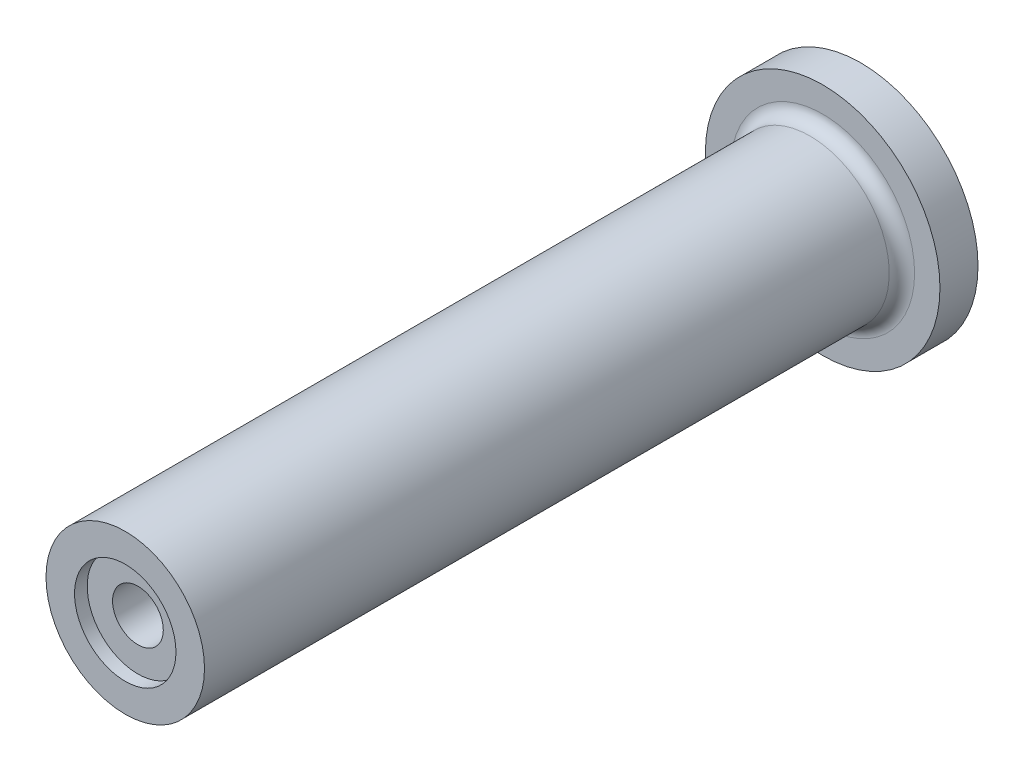
ISO-10303-21;
HEADER;
FILE_DESCRIPTION(('STEP AP214'),'2;1');
FILE_NAME('part.step','',(''),(''),'','','');
FILE_SCHEMA(('AUTOMOTIVE_DESIGN { 1 0 10303 214 1 1 1 1 }'));
ENDSEC;
DATA;
#1=APPLICATION_CONTEXT('core data for automotive mechanical design processes');
#2=APPLICATION_PROTOCOL_DEFINITION('international standard','automotive_design',2000,#1);
#3=PRODUCT_CONTEXT('',#1,'mechanical');
#4=PRODUCT('Part','Part','',(#3));
#5=PRODUCT_RELATED_PRODUCT_CATEGORY('part','',(#4));
#6=PRODUCT_DEFINITION_FORMATION('','',#4);
#7=PRODUCT_DEFINITION_CONTEXT('part definition',#1,'design');
#8=PRODUCT_DEFINITION('design','',#6,#7);
#9=PRODUCT_DEFINITION_SHAPE('','',#8);
#10=(LENGTH_UNIT() NAMED_UNIT(*) SI_UNIT(.MILLI.,.METRE.));
#11=(NAMED_UNIT(*) PLANE_ANGLE_UNIT() SI_UNIT($,.RADIAN.));
#12=(NAMED_UNIT(*) SI_UNIT($,.STERADIAN.) SOLID_ANGLE_UNIT());
#13=UNCERTAINTY_MEASURE_WITH_UNIT(LENGTH_MEASURE(1.E-05),#10,'distance_accuracy_value','');
#14=(GEOMETRIC_REPRESENTATION_CONTEXT(3) GLOBAL_UNCERTAINTY_ASSIGNED_CONTEXT((#13)) GLOBAL_UNIT_ASSIGNED_CONTEXT((#10,
#11,#12)) REPRESENTATION_CONTEXT('',''));
#15=CARTESIAN_POINT('',(0.,0.,0.));
#16=DIRECTION('',(0.,0.,1.));
#17=DIRECTION('',(1.,0.,0.));
#18=AXIS2_PLACEMENT_3D('',#15,#16,#17);
#19=CARTESIAN_POINT('',(0.,0.,55.));
#20=DIRECTION('',(0.,0.,-1.));
#21=DIRECTION('',(-1.,0.,0.));
#22=AXIS2_PLACEMENT_3D('',#19,#20,#21);
#23=CYLINDRICAL_SURFACE('',#22,4.);
#24=CARTESIAN_POINT('',(0.,0.,53.));
#25=DIRECTION('',(0.,0.,1.));
#26=DIRECTION('',(1.,0.,0.));
#27=AXIS2_PLACEMENT_3D('',#24,#25,#26);
#28=CIRCLE('',#27,4.);
#29=CARTESIAN_POINT('',(4.,0.,53.));
#30=VERTEX_POINT('',#29);
#31=EDGE_CURVE('E57',#30,#30,#28,.T.);
#32=ORIENTED_EDGE('',*,*,#31,.T.);
#33=EDGE_LOOP('',(#32));
#34=FACE_BOUND('',#33,.T.);
#35=CARTESIAN_POINT('',(0.,0.,-61.));
#36=DIRECTION('',(0.,0.,-1.));
#37=DIRECTION('',(-1.,0.,0.));
#38=AXIS2_PLACEMENT_3D('',#35,#36,#37);
#39=CIRCLE('',#38,4.);
#40=CARTESIAN_POINT('',(-4.,0.,-61.));
#41=VERTEX_POINT('',#40);
#42=EDGE_CURVE('E74',#41,#41,#39,.T.);
#43=ORIENTED_EDGE('',*,*,#42,.T.);
#44=EDGE_LOOP('',(#43));
#45=FACE_BOUND('',#44,.T.);
#46=ADVANCED_FACE('F37',(#34,#45),#23,.F.);
#47=CARTESIAN_POINT('',(0.,0.,55.));
#48=DIRECTION('',(0.,0.,1.));
#49=DIRECTION('',(1.,0.,0.));
#50=AXIS2_PLACEMENT_3D('',#47,#48,#49);
#51=PLANE('',#50);
#52=CARTESIAN_POINT('',(0.,0.,55.));
#53=DIRECTION('',(0.,0.,1.));
#54=DIRECTION('',(1.,0.,0.));
#55=AXIS2_PLACEMENT_3D('',#52,#53,#54);
#56=CIRCLE('',#55,8.);
#57=CARTESIAN_POINT('',(8.,0.,55.));
#58=VERTEX_POINT('',#57);
#59=EDGE_CURVE('E64',#58,#58,#56,.T.);
#60=ORIENTED_EDGE('',*,*,#59,.F.);
#61=EDGE_LOOP('',(#60));
#62=FACE_BOUND('',#61,.T.);
#63=CARTESIAN_POINT('',(0.,0.,55.));
#64=DIRECTION('',(0.,0.,1.));
#65=DIRECTION('',(1.,0.,0.));
#66=AXIS2_PLACEMENT_3D('',#63,#64,#65);
#67=CIRCLE('',#66,12.5);
#68=CARTESIAN_POINT('',(12.5,0.,55.));
#69=VERTEX_POINT('',#68);
#70=EDGE_CURVE('E51',#69,#69,#67,.T.);
#71=ORIENTED_EDGE('',*,*,#70,.T.);
#72=EDGE_LOOP('',(#71));
#73=FACE_BOUND('',#72,.T.);
#74=ADVANCED_FACE('F97',(#62,#73),#51,.T.);
#75=CARTESIAN_POINT('',(0.,0.,55.));
#76=DIRECTION('',(0.,0.,-1.));
#77=DIRECTION('',(-1.,0.,0.));
#78=AXIS2_PLACEMENT_3D('',#75,#76,#77);
#79=CYLINDRICAL_SURFACE('',#78,12.5);
#80=CARTESIAN_POINT('',(0.,0.,-53.));
#81=DIRECTION('',(0.,0.,-1.));
#82=DIRECTION('',(-1.,0.,0.));
#83=AXIS2_PLACEMENT_3D('',#80,#81,#82);
#84=CIRCLE('',#83,12.5);
#85=CARTESIAN_POINT('',(-12.5,0.,-53.));
#86=VERTEX_POINT('',#85);
#87=EDGE_CURVE('E10',#86,#86,#84,.F.);
#88=ORIENTED_EDGE('',*,*,#87,.T.);
#89=EDGE_LOOP('',(#88));
#90=FACE_BOUND('',#89,.T.);
#91=ORIENTED_EDGE('',*,*,#70,.F.);
#92=EDGE_LOOP('',(#91));
#93=FACE_BOUND('',#92,.T.);
#94=ADVANCED_FACE('F103',(#90,#93),#79,.T.);
#95=CARTESIAN_POINT('',(0.,0.,53.));
#96=DIRECTION('',(0.,0.,1.));
#97=DIRECTION('',(1.,0.,0.));
#98=AXIS2_PLACEMENT_3D('',#95,#96,#97);
#99=CYLINDRICAL_SURFACE('',#98,8.);
#100=CARTESIAN_POINT('',(0.,0.,53.));
#101=DIRECTION('',(0.,0.,1.));
#102=DIRECTION('',(1.,0.,0.));
#103=AXIS2_PLACEMENT_3D('',#100,#101,#102);
#104=CIRCLE('',#103,8.);
#105=CARTESIAN_POINT('',(8.,0.,53.));
#106=VERTEX_POINT('',#105);
#107=EDGE_CURVE('E62',#106,#106,#104,.T.);
#108=ORIENTED_EDGE('',*,*,#107,.F.);
#109=EDGE_LOOP('',(#108));
#110=FACE_BOUND('',#109,.T.);
#111=ORIENTED_EDGE('',*,*,#59,.T.);
#112=EDGE_LOOP('',(#111));
#113=FACE_BOUND('',#112,.T.);
#114=ADVANCED_FACE('F107',(#110,#113),#99,.F.);
#115=CARTESIAN_POINT('',(0.,0.,53.));
#116=DIRECTION('',(0.,0.,1.));
#117=DIRECTION('',(1.,0.,0.));
#118=AXIS2_PLACEMENT_3D('',#115,#116,#117);
#119=PLANE('',#118);
#120=ORIENTED_EDGE('',*,*,#31,.F.);
#121=EDGE_LOOP('',(#120));
#122=FACE_BOUND('',#121,.T.);
#123=ORIENTED_EDGE('',*,*,#107,.T.);
#124=EDGE_LOOP('',(#123));
#125=FACE_BOUND('',#124,.T.);
#126=ADVANCED_FACE('F94',(#122,#125),#119,.T.);
#127=CARTESIAN_POINT('',(0.,0.,-55.));
#128=DIRECTION('',(0.,0.,-1.));
#129=DIRECTION('',(-1.,0.,0.));
#130=AXIS2_PLACEMENT_3D('',#127,#128,#129);
#131=PLANE('',#130);
#132=CARTESIAN_POINT('',(0.,0.,-55.));
#133=DIRECTION('',(0.,0.,-1.));
#134=DIRECTION('',(-1.,0.,0.));
#135=AXIS2_PLACEMENT_3D('',#132,#133,#134);
#136=CIRCLE('',#135,14.5);
#137=CARTESIAN_POINT('',(-14.5,0.,-55.));
#138=VERTEX_POINT('',#137);
#139=EDGE_CURVE('E45',#138,#138,#136,.T.);
#140=ORIENTED_EDGE('',*,*,#139,.T.);
#141=EDGE_LOOP('',(#140));
#142=FACE_BOUND('',#141,.T.);
#143=CARTESIAN_POINT('',(0.,0.,-55.));
#144=DIRECTION('',(0.,0.,-1.));
#145=DIRECTION('',(-1.,0.,0.));
#146=AXIS2_PLACEMENT_3D('',#143,#144,#145);
#147=CIRCLE('',#146,18.5);
#148=CARTESIAN_POINT('',(-18.5,0.,-55.));
#149=VERTEX_POINT('',#148);
#150=EDGE_CURVE('E71',#149,#149,#147,.T.);
#151=ORIENTED_EDGE('',*,*,#150,.F.);
#152=EDGE_LOOP('',(#151));
#153=FACE_BOUND('',#152,.T.);
#154=ADVANCED_FACE('F85',(#142,#153),#131,.F.);
#155=CARTESIAN_POINT('',(0.,0.,-61.));
#156=DIRECTION('',(0.,0.,-1.));
#157=DIRECTION('',(-1.,0.,0.));
#158=AXIS2_PLACEMENT_3D('',#155,#156,#157);
#159=PLANE('',#158);
#160=CARTESIAN_POINT('',(0.,0.,-61.));
#161=DIRECTION('',(0.,0.,-1.));
#162=DIRECTION('',(-1.,0.,0.));
#163=AXIS2_PLACEMENT_3D('',#160,#161,#162);
#164=CIRCLE('',#163,18.5);
#165=CARTESIAN_POINT('',(-18.5,0.,-61.));
#166=VERTEX_POINT('',#165);
#167=EDGE_CURVE('E67',#166,#166,#164,.T.);
#168=ORIENTED_EDGE('',*,*,#167,.T.);
#169=EDGE_LOOP('',(#168));
#170=FACE_BOUND('',#169,.T.);
#171=ORIENTED_EDGE('',*,*,#42,.F.);
#172=EDGE_LOOP('',(#171));
#173=FACE_BOUND('',#172,.T.);
#174=ADVANCED_FACE('F82',(#170,#173),#159,.T.);
#175=CARTESIAN_POINT('',(0.,0.,-61.));
#176=DIRECTION('',(0.,0.,1.));
#177=DIRECTION('',(1.,0.,0.));
#178=AXIS2_PLACEMENT_3D('',#175,#176,#177);
#179=CYLINDRICAL_SURFACE('',#178,18.5);
#180=ORIENTED_EDGE('',*,*,#167,.F.);
#181=EDGE_LOOP('',(#180));
#182=FACE_BOUND('',#181,.T.);
#183=ORIENTED_EDGE('',*,*,#150,.T.);
#184=EDGE_LOOP('',(#183));
#185=FACE_BOUND('',#184,.T.);
#186=ADVANCED_FACE('F84',(#182,#185),#179,.T.);
#187=CARTESIAN_POINT('',(0.,0.,-53.));
#188=DIRECTION('',(0.,0.,-1.));
#189=DIRECTION('',(-1.,0.,0.));
#190=AXIS2_PLACEMENT_3D('',#187,#188,#189);
#191=TOROIDAL_SURFACE('',#190,14.5,2.);
#192=ORIENTED_EDGE('',*,*,#87,.F.);
#193=EDGE_LOOP('',(#192));
#194=FACE_BOUND('',#193,.T.);
#195=ORIENTED_EDGE('',*,*,#139,.F.);
#196=EDGE_LOOP('',(#195));
#197=FACE_BOUND('',#196,.T.);
#198=ADVANCED_FACE('F39',(#194,#197),#191,.F.);
#199=CLOSED_SHELL('',(#46,#74,#94,#114,#126,#154,#174,#186,#198));
#200=MANIFOLD_SOLID_BREP('B2',#199);
#201=ADVANCED_BREP_SHAPE_REPRESENTATION('',(#18,#200),#14);
#202=SHAPE_DEFINITION_REPRESENTATION(#9,#201);
ENDSEC;
END-ISO-10303-21;
